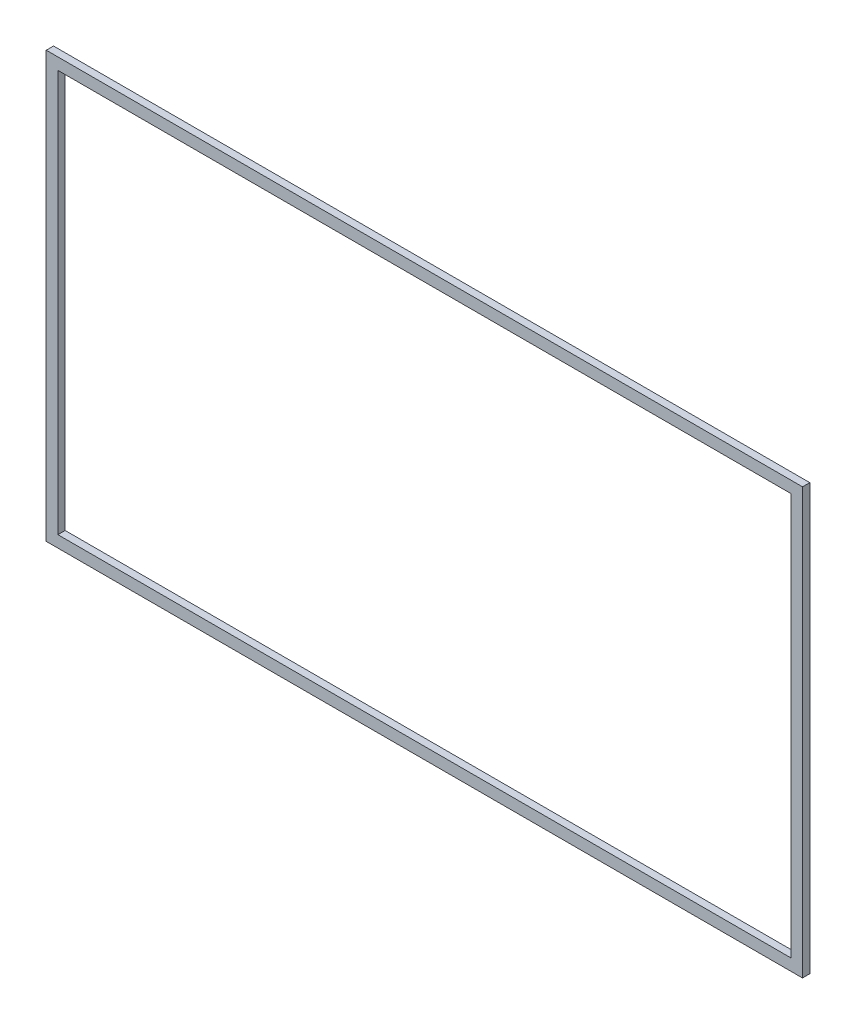
ISO-10303-21;
HEADER;
FILE_DESCRIPTION(('STEP AP214'),'2;1');
FILE_NAME('part.step','',(''),(''),'','','');
FILE_SCHEMA(('AUTOMOTIVE_DESIGN { 1 0 10303 214 1 1 1 1 }'));
ENDSEC;
DATA;
#1=APPLICATION_CONTEXT('core data for automotive mechanical design processes');
#2=APPLICATION_PROTOCOL_DEFINITION('international standard','automotive_design',2000,#1);
#3=PRODUCT_CONTEXT('',#1,'mechanical');
#4=PRODUCT('Part','Part','',(#3));
#5=PRODUCT_RELATED_PRODUCT_CATEGORY('part','',(#4));
#6=PRODUCT_DEFINITION_FORMATION('','',#4);
#7=PRODUCT_DEFINITION_CONTEXT('part definition',#1,'design');
#8=PRODUCT_DEFINITION('design','',#6,#7);
#9=PRODUCT_DEFINITION_SHAPE('','',#8);
#10=(LENGTH_UNIT() NAMED_UNIT(*) SI_UNIT(.MILLI.,.METRE.));
#11=(NAMED_UNIT(*) PLANE_ANGLE_UNIT() SI_UNIT($,.RADIAN.));
#12=(NAMED_UNIT(*) SI_UNIT($,.STERADIAN.) SOLID_ANGLE_UNIT());
#13=UNCERTAINTY_MEASURE_WITH_UNIT(LENGTH_MEASURE(1.E-05),#10,'distance_accuracy_value','');
#14=(GEOMETRIC_REPRESENTATION_CONTEXT(3) GLOBAL_UNCERTAINTY_ASSIGNED_CONTEXT((#13)) GLOBAL_UNIT_ASSIGNED_CONTEXT((#10,
#11,#12)) REPRESENTATION_CONTEXT('',''));
#15=CARTESIAN_POINT('',(0.,0.,0.));
#16=DIRECTION('',(0.,0.,1.));
#17=DIRECTION('',(1.,0.,0.));
#18=AXIS2_PLACEMENT_3D('',#15,#16,#17);
#19=CARTESIAN_POINT('',(0.,0.,0.5));
#20=DIRECTION('',(0.,0.,-1.));
#21=DIRECTION('',(-1.,0.,0.));
#22=AXIS2_PLACEMENT_3D('',#19,#20,#21);
#23=PLANE('',#22);
#24=DIRECTION('',(0.,1.,0.));
#25=VECTOR('',#24,1.);
#26=CARTESIAN_POINT('',(26.,-14.625,0.5));
#27=LINE('',#26,#25);
#28=CARTESIAN_POINT('',(26.,-14.625,0.5));
#29=VERTEX_POINT('',#28);
#30=CARTESIAN_POINT('',(26.,14.625,0.5));
#31=VERTEX_POINT('',#30);
#32=EDGE_CURVE('E153',#29,#31,#27,.T.);
#33=ORIENTED_EDGE('',*,*,#32,.T.);
#34=DIRECTION('',(-1.,0.,0.));
#35=VECTOR('',#34,1.);
#36=CARTESIAN_POINT('',(-26.,14.625,0.5));
#37=LINE('',#36,#35);
#38=CARTESIAN_POINT('',(-26.,14.625,0.5));
#39=VERTEX_POINT('',#38);
#40=EDGE_CURVE('E157',#31,#39,#37,.T.);
#41=ORIENTED_EDGE('',*,*,#40,.T.);
#42=DIRECTION('',(0.,-1.,0.));
#43=VECTOR('',#42,1.);
#44=CARTESIAN_POINT('',(-26.,-14.625,0.5));
#45=LINE('',#44,#43);
#46=CARTESIAN_POINT('',(-26.,-14.625,0.5));
#47=VERTEX_POINT('',#46);
#48=EDGE_CURVE('E161',#39,#47,#45,.T.);
#49=ORIENTED_EDGE('',*,*,#48,.T.);
#50=DIRECTION('',(1.,0.,0.));
#51=VECTOR('',#50,1.);
#52=CARTESIAN_POINT('',(-26.,-14.625,0.5));
#53=LINE('',#52,#51);
#54=EDGE_CURVE('E164',#47,#29,#53,.T.);
#55=ORIENTED_EDGE('',*,*,#54,.T.);
#56=EDGE_LOOP('',(#33,#41,#49,#55));
#57=FACE_BOUND('',#56,.T.);
#58=DIRECTION('',(0.,1.,0.));
#59=VECTOR('',#58,1.);
#60=CARTESIAN_POINT('',(25.2,-13.825,0.5));
#61=LINE('',#60,#59);
#62=CARTESIAN_POINT('',(25.2,-13.825,0.5));
#63=VERTEX_POINT('',#62);
#64=CARTESIAN_POINT('',(25.2,13.825,0.5));
#65=VERTEX_POINT('',#64);
#66=EDGE_CURVE('E105',#63,#65,#61,.T.);
#67=ORIENTED_EDGE('',*,*,#66,.F.);
#68=DIRECTION('',(1.,0.,0.));
#69=VECTOR('',#68,1.);
#70=CARTESIAN_POINT('',(-25.2,-13.825,0.5));
#71=LINE('',#70,#69);
#72=CARTESIAN_POINT('',(-25.2,-13.825,0.5));
#73=VERTEX_POINT('',#72);
#74=EDGE_CURVE('E131',#73,#63,#71,.T.);
#75=ORIENTED_EDGE('',*,*,#74,.F.);
#76=DIRECTION('',(0.,-1.,0.));
#77=VECTOR('',#76,1.);
#78=CARTESIAN_POINT('',(-25.2,-13.825,0.5));
#79=LINE('',#78,#77);
#80=CARTESIAN_POINT('',(-25.2,13.825,0.5));
#81=VERTEX_POINT('',#80);
#82=EDGE_CURVE('E127',#81,#73,#79,.T.);
#83=ORIENTED_EDGE('',*,*,#82,.F.);
#84=DIRECTION('',(-1.,0.,0.));
#85=VECTOR('',#84,1.);
#86=CARTESIAN_POINT('',(-25.2,13.825,0.5));
#87=LINE('',#86,#85);
#88=EDGE_CURVE('E114',#65,#81,#87,.T.);
#89=ORIENTED_EDGE('',*,*,#88,.F.);
#90=EDGE_LOOP('',(#67,#75,#83,#89));
#91=FACE_BOUND('',#90,.T.);
#92=ADVANCED_FACE('F39',(#57,#91),#23,.F.);
#93=CARTESIAN_POINT('',(0.,0.,0.));
#94=DIRECTION('',(0.,0.,-1.));
#95=DIRECTION('',(-1.,0.,0.));
#96=AXIS2_PLACEMENT_3D('',#93,#94,#95);
#97=PLANE('',#96);
#98=DIRECTION('',(0.,1.,0.));
#99=VECTOR('',#98,1.);
#100=CARTESIAN_POINT('',(26.,-14.625,0.));
#101=LINE('',#100,#99);
#102=CARTESIAN_POINT('',(26.,-14.625,0.));
#103=VERTEX_POINT('',#102);
#104=CARTESIAN_POINT('',(26.,14.625,0.));
#105=VERTEX_POINT('',#104);
#106=EDGE_CURVE('E123',#103,#105,#101,.T.);
#107=ORIENTED_EDGE('',*,*,#106,.F.);
#108=DIRECTION('',(1.,0.,0.));
#109=VECTOR('',#108,1.);
#110=CARTESIAN_POINT('',(-26.,-14.625,0.));
#111=LINE('',#110,#109);
#112=CARTESIAN_POINT('',(-26.,-14.625,0.));
#113=VERTEX_POINT('',#112);
#114=EDGE_CURVE('E158',#113,#103,#111,.T.);
#115=ORIENTED_EDGE('',*,*,#114,.F.);
#116=DIRECTION('',(0.,-1.,0.));
#117=VECTOR('',#116,1.);
#118=CARTESIAN_POINT('',(-26.,-14.625,0.));
#119=LINE('',#118,#117);
#120=CARTESIAN_POINT('',(-26.,14.625,0.));
#121=VERTEX_POINT('',#120);
#122=EDGE_CURVE('E174',#121,#113,#119,.T.);
#123=ORIENTED_EDGE('',*,*,#122,.F.);
#124=DIRECTION('',(-1.,0.,0.));
#125=VECTOR('',#124,1.);
#126=CARTESIAN_POINT('',(-26.,14.625,0.));
#127=LINE('',#126,#125);
#128=EDGE_CURVE('E171',#105,#121,#127,.T.);
#129=ORIENTED_EDGE('',*,*,#128,.F.);
#130=EDGE_LOOP('',(#107,#115,#123,#129));
#131=FACE_BOUND('',#130,.T.);
#132=DIRECTION('',(1.,0.,0.));
#133=VECTOR('',#132,1.);
#134=CARTESIAN_POINT('',(-25.2,-13.825,0.));
#135=LINE('',#134,#133);
#136=CARTESIAN_POINT('',(-25.2,-13.825,0.));
#137=VERTEX_POINT('',#136);
#138=CARTESIAN_POINT('',(25.2,-13.825,0.));
#139=VERTEX_POINT('',#138);
#140=EDGE_CURVE('E115',#137,#139,#135,.T.);
#141=ORIENTED_EDGE('',*,*,#140,.T.);
#142=DIRECTION('',(0.,1.,0.));
#143=VECTOR('',#142,1.);
#144=CARTESIAN_POINT('',(25.2,-13.825,0.));
#145=LINE('',#144,#143);
#146=CARTESIAN_POINT('',(25.2,13.825,0.));
#147=VERTEX_POINT('',#146);
#148=EDGE_CURVE('E63',#139,#147,#145,.T.);
#149=ORIENTED_EDGE('',*,*,#148,.T.);
#150=DIRECTION('',(-1.,0.,0.));
#151=VECTOR('',#150,1.);
#152=CARTESIAN_POINT('',(-25.2,13.825,0.));
#153=LINE('',#152,#151);
#154=CARTESIAN_POINT('',(-25.2,13.825,0.));
#155=VERTEX_POINT('',#154);
#156=EDGE_CURVE('E121',#147,#155,#153,.T.);
#157=ORIENTED_EDGE('',*,*,#156,.T.);
#158=DIRECTION('',(0.,-1.,0.));
#159=VECTOR('',#158,1.);
#160=CARTESIAN_POINT('',(-25.2,-13.825,0.));
#161=LINE('',#160,#159);
#162=EDGE_CURVE('E140',#155,#137,#161,.T.);
#163=ORIENTED_EDGE('',*,*,#162,.T.);
#164=EDGE_LOOP('',(#141,#149,#157,#163));
#165=FACE_BOUND('',#164,.T.);
#166=ADVANCED_FACE('F197',(#131,#165),#97,.T.);
#167=CARTESIAN_POINT('',(26.,-14.625,0.5));
#168=DIRECTION('',(-1.,0.,0.));
#169=DIRECTION('',(0.,0.,1.));
#170=AXIS2_PLACEMENT_3D('',#167,#168,#169);
#171=PLANE('',#170);
#172=ORIENTED_EDGE('',*,*,#106,.T.);
#173=DIRECTION('',(0.,0.,-1.));
#174=VECTOR('',#173,1.);
#175=CARTESIAN_POINT('',(26.,14.625,0.5));
#176=LINE('',#175,#174);
#177=EDGE_CURVE('E11',#31,#105,#176,.T.);
#178=ORIENTED_EDGE('',*,*,#177,.F.);
#179=ORIENTED_EDGE('',*,*,#32,.F.);
#180=DIRECTION('',(0.,0.,-1.));
#181=VECTOR('',#180,1.);
#182=CARTESIAN_POINT('',(26.,-14.625,0.5));
#183=LINE('',#182,#181);
#184=EDGE_CURVE('E167',#29,#103,#183,.T.);
#185=ORIENTED_EDGE('',*,*,#184,.T.);
#186=EDGE_LOOP('',(#172,#178,#179,#185));
#187=FACE_BOUND('',#186,.T.);
#188=ADVANCED_FACE('F41',(#187),#171,.F.);
#189=CARTESIAN_POINT('',(-26.,14.625,0.5));
#190=DIRECTION('',(0.,-1.,0.));
#191=DIRECTION('',(0.,0.,-1.));
#192=AXIS2_PLACEMENT_3D('',#189,#190,#191);
#193=PLANE('',#192);
#194=ORIENTED_EDGE('',*,*,#128,.T.);
#195=DIRECTION('',(0.,0.,-1.));
#196=VECTOR('',#195,1.);
#197=CARTESIAN_POINT('',(-26.,14.625,0.5));
#198=LINE('',#197,#196);
#199=EDGE_CURVE('E48',#39,#121,#198,.T.);
#200=ORIENTED_EDGE('',*,*,#199,.F.);
#201=ORIENTED_EDGE('',*,*,#40,.F.);
#202=ORIENTED_EDGE('',*,*,#177,.T.);
#203=EDGE_LOOP('',(#194,#200,#201,#202));
#204=FACE_BOUND('',#203,.T.);
#205=ADVANCED_FACE('F207',(#204),#193,.F.);
#206=CARTESIAN_POINT('',(-26.,-14.625,0.5));
#207=DIRECTION('',(1.,0.,0.));
#208=DIRECTION('',(0.,0.,-1.));
#209=AXIS2_PLACEMENT_3D('',#206,#207,#208);
#210=PLANE('',#209);
#211=ORIENTED_EDGE('',*,*,#122,.T.);
#212=DIRECTION('',(0.,0.,-1.));
#213=VECTOR('',#212,1.);
#214=CARTESIAN_POINT('',(-26.,-14.625,0.5));
#215=LINE('',#214,#213);
#216=EDGE_CURVE('E182',#47,#113,#215,.T.);
#217=ORIENTED_EDGE('',*,*,#216,.F.);
#218=ORIENTED_EDGE('',*,*,#48,.F.);
#219=ORIENTED_EDGE('',*,*,#199,.T.);
#220=EDGE_LOOP('',(#211,#217,#218,#219));
#221=FACE_BOUND('',#220,.T.);
#222=ADVANCED_FACE('F191',(#221),#210,.F.);
#223=CARTESIAN_POINT('',(-26.,-14.625,0.5));
#224=DIRECTION('',(0.,1.,0.));
#225=DIRECTION('',(0.,0.,1.));
#226=AXIS2_PLACEMENT_3D('',#223,#224,#225);
#227=PLANE('',#226);
#228=ORIENTED_EDGE('',*,*,#114,.T.);
#229=ORIENTED_EDGE('',*,*,#184,.F.);
#230=ORIENTED_EDGE('',*,*,#54,.F.);
#231=ORIENTED_EDGE('',*,*,#216,.T.);
#232=EDGE_LOOP('',(#228,#229,#230,#231));
#233=FACE_BOUND('',#232,.T.);
#234=ADVANCED_FACE('F201',(#233),#227,.F.);
#235=CARTESIAN_POINT('',(25.2,-13.825,0.5));
#236=DIRECTION('',(-1.,0.,0.));
#237=DIRECTION('',(0.,0.,1.));
#238=AXIS2_PLACEMENT_3D('',#235,#236,#237);
#239=PLANE('',#238);
#240=ORIENTED_EDGE('',*,*,#148,.F.);
#241=DIRECTION('',(0.,0.,-1.));
#242=VECTOR('',#241,1.);
#243=CARTESIAN_POINT('',(25.2,-13.825,0.5));
#244=LINE('',#243,#242);
#245=EDGE_CURVE('E109',#63,#139,#244,.T.);
#246=ORIENTED_EDGE('',*,*,#245,.F.);
#247=ORIENTED_EDGE('',*,*,#66,.T.);
#248=DIRECTION('',(0.,0.,-1.));
#249=VECTOR('',#248,1.);
#250=CARTESIAN_POINT('',(25.2,13.825,0.5));
#251=LINE('',#250,#249);
#252=EDGE_CURVE('E108',#65,#147,#251,.T.);
#253=ORIENTED_EDGE('',*,*,#252,.T.);
#254=EDGE_LOOP('',(#240,#246,#247,#253));
#255=FACE_BOUND('',#254,.T.);
#256=ADVANCED_FACE('F107',(#255),#239,.T.);
#257=CARTESIAN_POINT('',(-25.2,13.825,0.5));
#258=DIRECTION('',(0.,-1.,0.));
#259=DIRECTION('',(0.,0.,-1.));
#260=AXIS2_PLACEMENT_3D('',#257,#258,#259);
#261=PLANE('',#260);
#262=ORIENTED_EDGE('',*,*,#156,.F.);
#263=ORIENTED_EDGE('',*,*,#252,.F.);
#264=ORIENTED_EDGE('',*,*,#88,.T.);
#265=DIRECTION('',(0.,0.,-1.));
#266=VECTOR('',#265,1.);
#267=CARTESIAN_POINT('',(-25.2,13.825,0.5));
#268=LINE('',#267,#266);
#269=EDGE_CURVE('E124',#81,#155,#268,.T.);
#270=ORIENTED_EDGE('',*,*,#269,.T.);
#271=EDGE_LOOP('',(#262,#263,#264,#270));
#272=FACE_BOUND('',#271,.T.);
#273=ADVANCED_FACE('F118',(#272),#261,.T.);
#274=CARTESIAN_POINT('',(-25.2,-13.825,0.5));
#275=DIRECTION('',(1.,0.,0.));
#276=DIRECTION('',(0.,0.,-1.));
#277=AXIS2_PLACEMENT_3D('',#274,#275,#276);
#278=PLANE('',#277);
#279=ORIENTED_EDGE('',*,*,#162,.F.);
#280=ORIENTED_EDGE('',*,*,#269,.F.);
#281=ORIENTED_EDGE('',*,*,#82,.T.);
#282=DIRECTION('',(0.,0.,-1.));
#283=VECTOR('',#282,1.);
#284=CARTESIAN_POINT('',(-25.2,-13.825,0.5));
#285=LINE('',#284,#283);
#286=EDGE_CURVE('E55',#73,#137,#285,.T.);
#287=ORIENTED_EDGE('',*,*,#286,.T.);
#288=EDGE_LOOP('',(#279,#280,#281,#287));
#289=FACE_BOUND('',#288,.T.);
#290=ADVANCED_FACE('F230',(#289),#278,.T.);
#291=CARTESIAN_POINT('',(-25.2,-13.825,0.5));
#292=DIRECTION('',(0.,1.,0.));
#293=DIRECTION('',(0.,0.,1.));
#294=AXIS2_PLACEMENT_3D('',#291,#292,#293);
#295=PLANE('',#294);
#296=ORIENTED_EDGE('',*,*,#140,.F.);
#297=ORIENTED_EDGE('',*,*,#286,.F.);
#298=ORIENTED_EDGE('',*,*,#74,.T.);
#299=ORIENTED_EDGE('',*,*,#245,.T.);
#300=EDGE_LOOP('',(#296,#297,#298,#299));
#301=FACE_BOUND('',#300,.T.);
#302=ADVANCED_FACE('F234',(#301),#295,.T.);
#303=CLOSED_SHELL('',(#92,#166,#188,#205,#222,#234,#256,#273,#290,#302));
#304=MANIFOLD_SOLID_BREP('B2',#303);
#305=ADVANCED_BREP_SHAPE_REPRESENTATION('',(#18,#304),#14);
#306=SHAPE_DEFINITION_REPRESENTATION(#9,#305);
ENDSEC;
END-ISO-10303-21;
